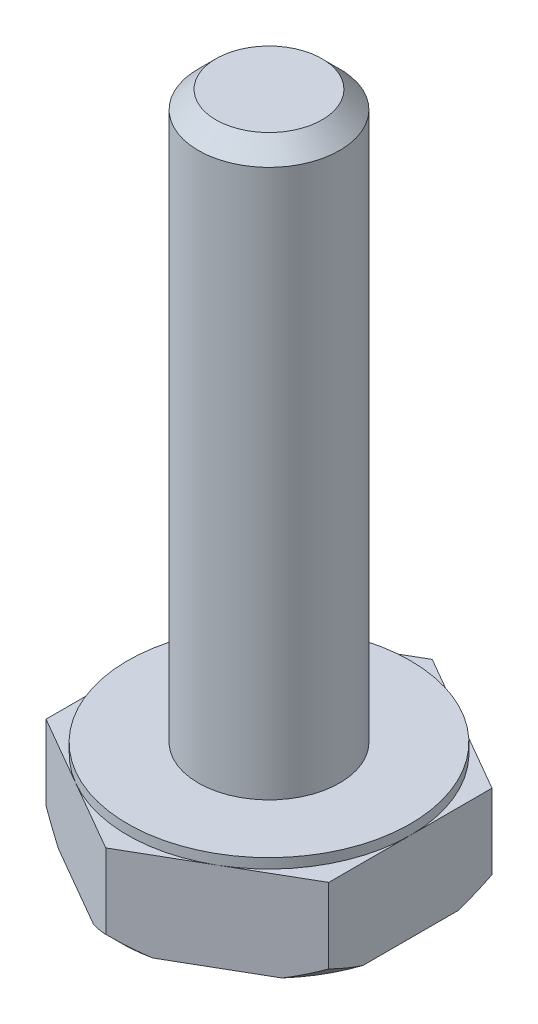
ISO-10303-21;
HEADER;
FILE_DESCRIPTION(('STEP AP214'),'2;1');
FILE_NAME('part.step','',(''),(''),'','','');
FILE_SCHEMA(('AUTOMOTIVE_DESIGN { 1 0 10303 214 1 1 1 1 }'));
ENDSEC;
DATA;
#1=APPLICATION_CONTEXT('core data for automotive mechanical design processes');
#2=APPLICATION_PROTOCOL_DEFINITION('international standard','automotive_design',2000,#1);
#3=PRODUCT_CONTEXT('',#1,'mechanical');
#4=PRODUCT('Part','Part','',(#3));
#5=PRODUCT_RELATED_PRODUCT_CATEGORY('part','',(#4));
#6=PRODUCT_DEFINITION_FORMATION('','',#4);
#7=PRODUCT_DEFINITION_CONTEXT('part definition',#1,'design');
#8=PRODUCT_DEFINITION('design','',#6,#7);
#9=PRODUCT_DEFINITION_SHAPE('','',#8);
#10=(LENGTH_UNIT() NAMED_UNIT(*) SI_UNIT(.MILLI.,.METRE.));
#11=(NAMED_UNIT(*) PLANE_ANGLE_UNIT() SI_UNIT($,.RADIAN.));
#12=(NAMED_UNIT(*) SI_UNIT($,.STERADIAN.) SOLID_ANGLE_UNIT());
#13=UNCERTAINTY_MEASURE_WITH_UNIT(LENGTH_MEASURE(1.E-05),#10,'distance_accuracy_value','');
#14=(GEOMETRIC_REPRESENTATION_CONTEXT(3) GLOBAL_UNCERTAINTY_ASSIGNED_CONTEXT((#13)) GLOBAL_UNIT_ASSIGNED_CONTEXT((#10,
#11,#12)) REPRESENTATION_CONTEXT('',''));
#15=CARTESIAN_POINT('',(0.,0.,0.));
#16=DIRECTION('',(0.,0.,1.));
#17=DIRECTION('',(1.,0.,0.));
#18=AXIS2_PLACEMENT_3D('',#15,#16,#17);
#19=CARTESIAN_POINT('',(2.,-1.4,1.15470053837925));
#20=DIRECTION('',(-0.5,0.,-0.866025403784439));
#21=DIRECTION('',(-0.866025403784439,0.,0.5));
#22=AXIS2_PLACEMENT_3D('',#19,#20,#21);
#23=PLANE('',#22);
#24=CARTESIAN_POINT('',(3.3910270920571,-0.100195782274932,0.351590672330025));
#25=CARTESIAN_POINT('',(3.34354492104427,-0.144594369777861,0.379004516545986));
#26=CARTESIAN_POINT('',(3.29587314771856,-0.188722194214535,0.406527827708332));
#27=CARTESIAN_POINT('',(3.20008478309438,-0.276339275319588,0.461831265809335));
#28=CARTESIAN_POINT('',(3.15196815217326,-0.31982847419622,0.489611415624142));
#29=CARTESIAN_POINT('',(3.00663470734059,-0.449386265959303,0.573519719120544));
#30=CARTESIAN_POINT('',(2.90866023209742,-0.534332308383371,0.6300853087759));
#31=CARTESIAN_POINT('',(2.70727689839547,-0.702313701082601,0.746354030699024));
#32=CARTESIAN_POINT('',(2.60379268655646,-0.785229331210698,0.80610066826115));
#33=CARTESIAN_POINT('',(2.39312491527532,-0.944399581791169,0.927729762719897));
#34=CARTESIAN_POINT('',(2.28594528845487,-1.0206609958631,0.989609949116325));
#35=CARTESIAN_POINT('',(2.12041002695036,-1.12802642435662,1.08518177690633));
#36=CARTESIAN_POINT('',(2.06391337670326,-1.16292144649884,1.1178001331348));
#37=CARTESIAN_POINT('',(1.94946166154732,-1.22933713888442,1.1838788616893));
#38=CARTESIAN_POINT('',(1.89150639158025,-1.26085733137186,1.21733935240575));
#39=CARTESIAN_POINT('',(1.71580642824051,-1.34875156017951,1.31877977353656));
#40=CARTESIAN_POINT('',(1.59552388469169,-1.39893934247507,1.38822493243328));
#41=CARTESIAN_POINT('',(1.42261342322878,-1.45147464181688,1.48805483390459));
#42=CARTESIAN_POINT('',(1.37238177229886,-1.464508697261,1.51705609109082));
#43=CARTESIAN_POINT('',(1.27118130087747,-1.48585011351804,1.57548421050808));
#44=CARTESIAN_POINT('',(1.22021288943875,-1.49416000110673,1.60491083657239));
#45=CARTESIAN_POINT('',(1.11791583738946,-1.50563215368217,1.66397206711035));
#46=CARTESIAN_POINT('',(1.06658785263823,-1.5088021297567,1.69360629292343));
#47=CARTESIAN_POINT('',(0.96388966784885,-1.50984521354556,1.75289911755687));
#48=CARTESIAN_POINT('',(0.912519467250178,-1.50771824975614,1.78255771670084));
#49=CARTESIAN_POINT('',(0.810289296839596,-1.49829850913321,1.84158033310669));
#50=CARTESIAN_POINT('',(0.759428287920763,-1.49102052474989,1.87094495029723));
#51=CARTESIAN_POINT('',(0.658389988435767,-1.47168571303428,1.92927943970336));
#52=CARTESIAN_POINT('',(0.608212859359108,-1.45962777652917,1.95824921868293));
#53=CARTESIAN_POINT('',(0.50863160466104,-1.43122675618574,2.0157424828891));
#54=CARTESIAN_POINT('',(0.459230174418972,-1.41487122151319,2.04426441193771));
#55=CARTESIAN_POINT('',(0.361466257287717,-1.37849100925759,2.10070843581047));
#56=CARTESIAN_POINT('',(0.313103718239691,-1.35846651636251,2.12863056074854));
#57=CARTESIAN_POINT('',(0.199799105244888,-1.30737607555432,2.19404700956152));
#58=CARTESIAN_POINT('',(0.135315115130632,-1.27496059736795,2.23127685861241));
#59=CARTESIAN_POINT('',(0.00818006045399488,-1.20561721016145,2.3046783166534));
#60=CARTESIAN_POINT('',(-0.0544699994200348,-1.16868688304807,2.34084934558642));
#61=CARTESIAN_POINT('',(-0.178251246858647,-1.09125768375401,2.41231448211573));
#62=CARTESIAN_POINT('',(-0.239378976613405,-1.05075149602712,2.44760659334459));
#63=CARTESIAN_POINT('',(-0.360192679905363,-0.967014392289174,2.517358417462));
#64=CARTESIAN_POINT('',(-0.419878908751582,-0.923783963746002,2.55181827775328));
#65=CARTESIAN_POINT('',(-0.597659224843745,-0.790500603698508,2.6544597911057));
#66=CARTESIAN_POINT('',(-0.713928810209164,-0.697211033882321,2.72158806751499));
#67=CARTESIAN_POINT('',(-0.942866367163964,-0.505274888207762,2.85376522765046));
#68=CARTESIAN_POINT('',(-1.05553780865463,-0.40663373724072,2.91881611472508));
#69=CARTESIAN_POINT('',(-1.20463750696756,-0.272142780819644,3.00489886568214));
#70=CARTESIAN_POINT('',(-1.24218375119835,-0.237933000868121,3.02657619989585));
#71=CARTESIAN_POINT('',(-1.31686720192227,-0.169268680695386,3.06969471027532));
#72=CARTESIAN_POINT('',(-1.35400543619641,-0.134815631473534,3.09113647983072));
#73=CARTESIAN_POINT('',(-1.3910270920571,-0.100195782274933,3.11251094280773));
#74=B_SPLINE_CURVE_WITH_KNOTS('',3,(#24,#25,#26,#27,#28,#29,#30,#31,#32,#33,#34,#35,#36,#37,#38,
#39,#40,#41,#42,#43,#44,#45,#46,#47,#48,#49,#50,#51,#52,#53,#54,#55,#56,#57,#58,#59,#60,#61,#62,
#63,#64,#65,#66,#67,#68,#69,#70,#71,#72,#73),.UNSPECIFIED.,.F.,.F.,(4,2,2,2,2,2,2,2,2,2,2,2,2,2,
2,2,2,2,2,2,2,2,2,2,4),(0.,0.211648022391108,0.423315081060597,0.847658721996938,
1.28385997898958,1.71961055439068,1.94146481208378,2.16335043504383,2.60430249046376,
2.78249290019255,2.96058791283644,3.13841549262573,3.31624547293468,3.49356683109208,
3.67092936021967,3.84881151394884,4.02668471590855,4.27010777970963,4.51366179358974,
4.75772616245818,5.00174698247488,5.49195576057539,5.98167657652388,6.14735391628999,
6.31237991032623),.UNSPECIFIED.);
#75=CARTESIAN_POINT('',(2.,-1.2,1.15470053837925));
#76=VERTEX_POINT('',#75);
#77=CARTESIAN_POINT('',(1.58067174631839,-1.4,1.39679981852114));
#78=VERTEX_POINT('',#77);
#79=EDGE_CURVE('E164',#76,#78,#74,.T.);
#80=ORIENTED_EDGE('',*,*,#79,.F.);
#81=DIRECTION('',(0.,1.,0.));
#82=VECTOR('',#81,1.);
#83=CARTESIAN_POINT('',(2.,-1.4,1.15470053837925));
#84=LINE('',#83,#82);
#85=CARTESIAN_POINT('',(2.,-0.14,1.15470053837925));
#86=VERTEX_POINT('',#85);
#87=EDGE_CURVE('E196',#76,#86,#84,.T.);
#88=ORIENTED_EDGE('',*,*,#87,.T.);
#89=DIRECTION('',(-0.866025403784439,0.,0.5));
#90=VECTOR('',#89,1.);
#91=CARTESIAN_POINT('',(2.,-0.14,1.15470053837925));
#92=LINE('',#91,#90);
#93=CARTESIAN_POINT('',(1.,-0.14,1.73205080756888));
#94=VERTEX_POINT('',#93);
#95=EDGE_CURVE('E197',#86,#94,#92,.T.);
#96=ORIENTED_EDGE('',*,*,#95,.T.);
#97=CARTESIAN_POINT('',(0.,-0.14,2.3094010767585));
#98=VERTEX_POINT('',#97);
#99=EDGE_CURVE('E162',#94,#98,#92,.T.);
#100=ORIENTED_EDGE('',*,*,#99,.T.);
#101=DIRECTION('',(0.,1.,0.));
#102=VECTOR('',#101,1.);
#103=CARTESIAN_POINT('',(0.,-1.4,2.3094010767585));
#104=LINE('',#103,#102);
#105=CARTESIAN_POINT('',(0.,-1.2,2.3094010767585));
#106=VERTEX_POINT('',#105);
#107=EDGE_CURVE('E161',#106,#98,#104,.T.);
#108=ORIENTED_EDGE('',*,*,#107,.F.);
#109=CARTESIAN_POINT('',(0.419328253681606,-1.4,2.06730179661661));
#110=VERTEX_POINT('',#109);
#111=EDGE_CURVE('E145',#110,#106,#74,.T.);
#112=ORIENTED_EDGE('',*,*,#111,.F.);
#113=DIRECTION('',(-0.866025403784439,0.,0.5));
#114=VECTOR('',#113,1.);
#115=CARTESIAN_POINT('',(2.,-1.4,1.15470053837925));
#116=LINE('',#115,#114);
#117=EDGE_CURVE('E159',#78,#110,#116,.T.);
#118=ORIENTED_EDGE('',*,*,#117,.F.);
#119=EDGE_LOOP('',(#80,#88,#96,#100,#108,#112,#118));
#120=FACE_BOUND('',#119,.T.);
#121=ADVANCED_FACE('F36',(#120),#23,.F.);
#122=CARTESIAN_POINT('',(0.,-1.4,2.3094010767585));
#123=DIRECTION('',(0.499999999999999,0.,-0.866025403784439));
#124=DIRECTION('',(-0.866025403784439,0.,-0.5));
#125=AXIS2_PLACEMENT_3D('',#122,#123,#124);
#126=PLANE('',#125);
#127=CARTESIAN_POINT('',(1.3910270920571,-0.100195782274932,3.11251094280773));
#128=CARTESIAN_POINT('',(1.34354492104428,-0.144594369777861,3.08509709859177));
#129=CARTESIAN_POINT('',(1.29587314771856,-0.188722194214535,3.05757378742942));
#130=CARTESIAN_POINT('',(1.20008478309439,-0.276339275319587,3.00227034932842));
#131=CARTESIAN_POINT('',(1.15196815217327,-0.31982847419622,2.97449019951361));
#132=CARTESIAN_POINT('',(1.00663470734059,-0.449386265959303,2.89058189601721));
#133=CARTESIAN_POINT('',(0.908660232097419,-0.534332308383371,2.83401630636185));
#134=CARTESIAN_POINT('',(0.707276898395472,-0.702313701082601,2.71774758443873));
#135=CARTESIAN_POINT('',(0.603792686556467,-0.785229331210697,2.65800094687661));
#136=CARTESIAN_POINT('',(0.393124915275324,-0.944399581791167,2.53637185241786));
#137=CARTESIAN_POINT('',(0.285945288454877,-1.0206609958631,2.47449166602143));
#138=CARTESIAN_POINT('',(0.120410026950362,-1.12802642435661,2.37891983823142));
#139=CARTESIAN_POINT('',(0.0639133767032671,-1.16292144649884,2.34630148200295));
#140=CARTESIAN_POINT('',(-0.0505383384526776,-1.22933713888442,2.28022275344845));
#141=CARTESIAN_POINT('',(-0.108493608419747,-1.26085733137186,2.24676226273201));
#142=CARTESIAN_POINT('',(-0.284193571759491,-1.34875156017951,2.1453218416012));
#143=CARTESIAN_POINT('',(-0.404476115308308,-1.39893934247507,2.07587668270448));
#144=CARTESIAN_POINT('',(-0.577386576771219,-1.45147464181688,1.97604678123316));
#145=CARTESIAN_POINT('',(-0.62761822770114,-1.464508697261,1.94704552404693));
#146=CARTESIAN_POINT('',(-0.728818699122525,-1.48585011351804,1.88861740462968));
#147=CARTESIAN_POINT('',(-0.779787110561246,-1.49416000110673,1.85919077856537));
#148=CARTESIAN_POINT('',(-0.882084162610538,-1.50563215368217,1.8001295480274));
#149=CARTESIAN_POINT('',(-0.933412147361764,-1.5088021297567,1.77049532221432));
#150=CARTESIAN_POINT('',(-1.03611033215115,-1.50984521354556,1.71120249758089));
#151=CARTESIAN_POINT('',(-1.08748053274982,-1.50771824975614,1.68154389843692));
#152=CARTESIAN_POINT('',(-1.1897107031604,-1.49829850913321,1.62252128203107));
#153=CARTESIAN_POINT('',(-1.24057171207923,-1.49102052474989,1.59315666484052));
#154=CARTESIAN_POINT('',(-1.34161001156423,-1.47168571303428,1.5348221754344));
#155=CARTESIAN_POINT('',(-1.39178714064089,-1.45962777652917,1.50585239645483));
#156=CARTESIAN_POINT('',(-1.49136839533896,-1.43122675618574,1.44835913224866));
#157=CARTESIAN_POINT('',(-1.54076982558103,-1.41487122151319,1.41983720320005));
#158=CARTESIAN_POINT('',(-1.63853374271228,-1.3784910092576,1.36339317932728));
#159=CARTESIAN_POINT('',(-1.68689628176031,-1.35846651636251,1.33547105438921));
#160=CARTESIAN_POINT('',(-1.80020089475511,-1.30737607555433,1.27005460557624));
#161=CARTESIAN_POINT('',(-1.86468488486936,-1.27496059736795,1.23282475652535));
#162=CARTESIAN_POINT('',(-1.991819939546,-1.20561721016146,1.15942329848436));
#163=CARTESIAN_POINT('',(-2.05446999942003,-1.16868688304807,1.12325226955134));
#164=CARTESIAN_POINT('',(-2.17825124685864,-1.09125768375401,1.05178713302203));
#165=CARTESIAN_POINT('',(-2.2393789766134,-1.05075149602712,1.01649502179317));
#166=CARTESIAN_POINT('',(-2.36019267990536,-0.967014392289178,0.946743197675762));
#167=CARTESIAN_POINT('',(-2.41987890875158,-0.923783963746006,0.912283337384484));
#168=CARTESIAN_POINT('',(-2.59765922484374,-0.790500603698513,0.809641824032057));
#169=CARTESIAN_POINT('',(-2.71392881020916,-0.697211033882326,0.742513547622766));
#170=CARTESIAN_POINT('',(-2.94286636716396,-0.505274888207768,0.610336387487298));
#171=CARTESIAN_POINT('',(-3.05553780865462,-0.406633737240726,0.545285500412679));
#172=CARTESIAN_POINT('',(-3.20463750696755,-0.27214278081965,0.459202749455619));
#173=CARTESIAN_POINT('',(-3.24218375119834,-0.237933000868126,0.437525415241911));
#174=CARTESIAN_POINT('',(-3.31686720192227,-0.169268680695388,0.394406904862439));
#175=CARTESIAN_POINT('',(-3.35400543619641,-0.134815631473534,0.372965135307037));
#176=CARTESIAN_POINT('',(-3.3910270920571,-0.100195782274931,0.351590672330025));
#177=B_SPLINE_CURVE_WITH_KNOTS('',3,(#127,#128,#129,#130,#131,#132,#133,#134,#135,#136,#137,
#138,#139,#140,#141,#142,#143,#144,#145,#146,#147,#148,#149,#150,#151,#152,#153,#154,#155,#156,
#157,#158,#159,#160,#161,#162,#163,#164,#165,#166,#167,#168,#169,#170,#171,#172,#173,#174,#175,
#176),.UNSPECIFIED.,.F.,.F.,(4,2,2,2,2,2,2,2,2,2,2,2,2,2,2,2,2,2,2,2,2,2,2,2,4),(0.,
0.211648022391107,0.423315081060596,0.847658721996936,1.28385997898958,1.71961055439067,
1.94146481208377,2.16335043504383,2.60430249046375,2.78249290019255,2.96058791283644,
3.13841549262573,3.31624547293468,3.49356683109207,3.67092936021967,3.84881151394884,
4.02668471590855,4.27010777970963,4.51366179358973,4.75772616245818,5.00174698247488,
5.49195576057538,5.98167657652387,6.14735391628999,6.31237991032624),.UNSPECIFIED.);
#178=CARTESIAN_POINT('',(-0.419328253681603,-1.4,2.06730179661661));
#179=VERTEX_POINT('',#178);
#180=EDGE_CURVE('E147',#106,#179,#177,.T.);
#181=ORIENTED_EDGE('',*,*,#180,.F.);
#182=ORIENTED_EDGE('',*,*,#107,.T.);
#183=DIRECTION('',(-0.866025403784439,0.,-0.499999999999999));
#184=VECTOR('',#183,1.);
#185=CARTESIAN_POINT('',(0.,-0.14,2.3094010767585));
#186=LINE('',#185,#184);
#187=CARTESIAN_POINT('',(-0.999999999999999,-0.14,1.73205080756888));
#188=VERTEX_POINT('',#187);
#189=EDGE_CURVE('E201',#98,#188,#186,.T.);
#190=ORIENTED_EDGE('',*,*,#189,.T.);
#191=CARTESIAN_POINT('',(-2.,-0.14,1.15470053837925));
#192=VERTEX_POINT('',#191);
#193=EDGE_CURVE('E200',#188,#192,#186,.T.);
#194=ORIENTED_EDGE('',*,*,#193,.T.);
#195=DIRECTION('',(0.,1.,0.));
#196=VECTOR('',#195,1.);
#197=CARTESIAN_POINT('',(-2.,-1.4,1.15470053837925));
#198=LINE('',#197,#196);
#199=CARTESIAN_POINT('',(-2.,-1.2,1.15470053837925));
#200=VERTEX_POINT('',#199);
#201=EDGE_CURVE('E223',#200,#192,#198,.T.);
#202=ORIENTED_EDGE('',*,*,#201,.F.);
#203=CARTESIAN_POINT('',(-1.58067174631839,-1.4,1.39679981852114));
#204=VERTEX_POINT('',#203);
#205=EDGE_CURVE('E178',#204,#200,#177,.T.);
#206=ORIENTED_EDGE('',*,*,#205,.F.);
#207=DIRECTION('',(-0.866025403784439,0.,-0.499999999999999));
#208=VECTOR('',#207,1.);
#209=CARTESIAN_POINT('',(0.,-1.4,2.3094010767585));
#210=LINE('',#209,#208);
#211=EDGE_CURVE('E169',#179,#204,#210,.T.);
#212=ORIENTED_EDGE('',*,*,#211,.F.);
#213=EDGE_LOOP('',(#181,#182,#190,#194,#202,#206,#212));
#214=FACE_BOUND('',#213,.T.);
#215=ADVANCED_FACE('F303',(#214),#126,.F.);
#216=CARTESIAN_POINT('',(-2.,-1.4,1.15470053837925));
#217=DIRECTION('',(1.,0.,0.));
#218=DIRECTION('',(0.,0.,-1.));
#219=AXIS2_PLACEMENT_3D('',#216,#217,#218);
#220=PLANE('',#219);
#221=CARTESIAN_POINT('',(-2.,-0.272005647039239,2.54572763043635));
#222=CARTESIAN_POINT('',(-2.,-0.316975037574743,2.48852994499579));
#223=CARTESIAN_POINT('',(-2.,-0.361598260022792,2.4310565421804));
#224=CARTESIAN_POINT('',(-2.,-0.450003271813665,2.31545160217196));
#225=CARTESIAN_POINT('',(-2.,-0.493784919916561,2.25731995706426));
#226=CARTESIAN_POINT('',(-2.,-0.580564562415125,2.14001077548503));
#227=CARTESIAN_POINT('',(-2.,-0.62355738661351,2.08082940421716));
#228=CARTESIAN_POINT('',(-2.,-0.708313034538815,1.96159468645173));
#229=CARTESIAN_POINT('',(-2.,-0.750075917767917,1.90154138234716));
#230=CARTESIAN_POINT('',(-2.,-0.834155232348446,1.77739420471745));
#231=CARTESIAN_POINT('',(-2.,-0.87639515559175,1.71324831588814));
#232=CARTESIAN_POINT('',(-2.,-0.958822018340042,1.58365223475809));
#233=CARTESIAN_POINT('',(-2.,-0.999009131326467,1.51820215332567));
#234=CARTESIAN_POINT('',(-2.,-1.0767323603198,1.38590678310664));
#235=CARTESIAN_POINT('',(-2.,-1.11427342206818,1.31906441701374));
#236=CARTESIAN_POINT('',(-2.,-1.1860947484259,1.18365795126856));
#237=CARTESIAN_POINT('',(-2.,-1.22037591322758,1.11509433357404));
#238=CARTESIAN_POINT('',(-2.,-1.28143247059953,0.983303797242553));
#239=CARTESIAN_POINT('',(-2.,-1.30861786964741,0.920268247578223));
#240=CARTESIAN_POINT('',(-2.,-1.35888901505767,0.79255705555972));
#241=CARTESIAN_POINT('',(-2.,-1.3819743666918,0.727881255976266));
#242=CARTESIAN_POINT('',(-2.,-1.42290625101822,0.597688548618581));
#243=CARTESIAN_POINT('',(-2.,-1.44081000077024,0.532189878677661));
#244=CARTESIAN_POINT('',(-2.,-1.47083203570401,0.399885349952513));
#245=CARTESIAN_POINT('',(-2.,-1.48295263248925,0.333080024590104));
#246=CARTESIAN_POINT('',(-2.,-1.50083417338571,0.197344496728344));
#247=CARTESIAN_POINT('',(-2.,-1.50647308291583,0.128397860061204));
#248=CARTESIAN_POINT('',(-2.,-1.51056851351583,-0.00970684740618085));
#249=CARTESIAN_POINT('',(-2.,-1.50902562079984,-0.0788649004890811));
#250=CARTESIAN_POINT('',(-2.,-1.49885915750695,-0.216868519098935));
#251=CARTESIAN_POINT('',(-2.,-1.49021319141547,-0.285712402764717));
#252=CARTESIAN_POINT('',(-2.,-1.46641894880563,-0.422260210478995));
#253=CARTESIAN_POINT('',(-2.,-1.45126893479239,-0.489963824889282));
#254=CARTESIAN_POINT('',(-2.,-1.40965675858909,-0.645094306010171));
#255=CARTESIAN_POINT('',(-2.,-1.38113054870437,-0.731963067258214));
#256=CARTESIAN_POINT('',(-2.,-1.31650163338185,-0.902818246460519));
#257=CARTESIAN_POINT('',(-2.,-1.28039430480769,-0.986802869071232));
#258=CARTESIAN_POINT('',(-2.,-1.20219846539526,-1.1526353367736));
#259=CARTESIAN_POINT('',(-2.,-1.16006913864542,-1.23446367366693));
#260=CARTESIAN_POINT('',(-2.,-1.07148730645871,-1.39569249562416));
#261=CARTESIAN_POINT('',(-2.,-1.02503583237866,-1.47509355391136));
#262=CARTESIAN_POINT('',(-2.,-0.923301843612273,-1.64093947364516));
#263=CARTESIAN_POINT('',(-2.,-0.867619257183801,-1.72713724476575));
#264=CARTESIAN_POINT('',(-2.,-0.753218152094097,-1.8975038941697));
#265=CARTESIAN_POINT('',(-2.,-0.69449902479636,-1.9816723607086));
#266=CARTESIAN_POINT('',(-2.,-0.576061411354393,-2.1465577639636));
#267=CARTESIAN_POINT('',(-2.,-0.516391783710413,-2.22730999043807));
#268=CARTESIAN_POINT('',(-2.,-0.395360845348134,-2.38745478871758));
#269=CARTESIAN_POINT('',(-2.,-0.334000684100647,-2.46684822764876));
#270=CARTESIAN_POINT('',(-2.,-0.272005647039238,-2.54572763043635));
#271=B_SPLINE_CURVE_WITH_KNOTS('',3,(#221,#222,#223,#224,#225,#226,#227,#228,#229,#230,#231,
#232,#233,#234,#235,#236,#237,#238,#239,#240,#241,#242,#243,#244,#245,#246,#247,#248,#249,#250,
#251,#252,#253,#254,#255,#256,#257,#258,#259,#260,#261,#262,#263,#264,#265,#266,#267,#268,#269,
#270),.UNSPECIFIED.,.F.,.F.,(4,2,2,2,2,2,2,2,2,2,2,2,2,2,2,2,2,2,2,2,2,2,2,2,4),(0.,
0.218278765729078,0.436593850467245,0.656028511994943,0.875452540198025,1.10583433265688,
1.33619662340527,1.56611625196332,1.7959722047045,2.00179997803448,2.20764755651286,
2.41112685243713,2.61452474669124,2.8216924546329,3.02884325282048,3.23664970158397,
3.44451169845146,3.71832778451014,3.99231133728719,4.26824867682538,4.54412033985116,
4.85188981387714,5.15972121735645,5.46091423295189,5.76190727591802),.UNSPECIFIED.);
#272=CARTESIAN_POINT('',(-2.,-1.4,0.67050197809547));
#273=VERTEX_POINT('',#272);
#274=EDGE_CURVE('E297',#200,#273,#271,.T.);
#275=ORIENTED_EDGE('',*,*,#274,.F.);
#276=ORIENTED_EDGE('',*,*,#201,.T.);
#277=DIRECTION('',(0.,0.,-1.));
#278=VECTOR('',#277,1.);
#279=CARTESIAN_POINT('',(-2.,-0.14,1.15470053837925));
#280=LINE('',#279,#278);
#281=CARTESIAN_POINT('',(-2.,-0.14,0.));
#282=VERTEX_POINT('',#281);
#283=EDGE_CURVE('E205',#192,#282,#280,.T.);
#284=ORIENTED_EDGE('',*,*,#283,.T.);
#285=CARTESIAN_POINT('',(-2.,-0.14,-1.15470053837925));
#286=VERTEX_POINT('',#285);
#287=EDGE_CURVE('E204',#282,#286,#280,.T.);
#288=ORIENTED_EDGE('',*,*,#287,.T.);
#289=DIRECTION('',(0.,1.,0.));
#290=VECTOR('',#289,1.);
#291=CARTESIAN_POINT('',(-2.,-1.4,-1.15470053837925));
#292=LINE('',#291,#290);
#293=CARTESIAN_POINT('',(-2.,-1.2,-1.15470053837925));
#294=VERTEX_POINT('',#293);
#295=EDGE_CURVE('E221',#294,#286,#292,.T.);
#296=ORIENTED_EDGE('',*,*,#295,.F.);
#297=CARTESIAN_POINT('',(-2.,-1.4,-0.67050197809547));
#298=VERTEX_POINT('',#297);
#299=EDGE_CURVE('E291',#298,#294,#271,.T.);
#300=ORIENTED_EDGE('',*,*,#299,.F.);
#301=DIRECTION('',(0.,0.,-1.));
#302=VECTOR('',#301,1.);
#303=CARTESIAN_POINT('',(-2.,-1.4,1.15470053837925));
#304=LINE('',#303,#302);
#305=EDGE_CURVE('E172',#273,#298,#304,.T.);
#306=ORIENTED_EDGE('',*,*,#305,.F.);
#307=EDGE_LOOP('',(#275,#276,#284,#288,#296,#300,#306));
#308=FACE_BOUND('',#307,.T.);
#309=ADVANCED_FACE('F299',(#308),#220,.F.);
#310=CARTESIAN_POINT('',(-2.,-1.4,-1.15470053837925));
#311=DIRECTION('',(0.5,0.,0.866025403784439));
#312=DIRECTION('',(0.866025403784439,0.,-0.5));
#313=AXIS2_PLACEMENT_3D('',#310,#311,#312);
#314=PLANE('',#313);
#315=CARTESIAN_POINT('',(-3.3910270920571,-0.100195782274932,-0.351590672330026));
#316=CARTESIAN_POINT('',(-3.34354492104427,-0.144594369777861,-0.379004516545987));
#317=CARTESIAN_POINT('',(-3.29587314771856,-0.188722194214535,-0.406527827708333));
#318=CARTESIAN_POINT('',(-3.20008478309438,-0.276339275319587,-0.461831265809337));
#319=CARTESIAN_POINT('',(-3.15196815217326,-0.319828474196219,-0.489611415624143));
#320=CARTESIAN_POINT('',(-3.00663470734059,-0.449386265959303,-0.573519719120545));
#321=CARTESIAN_POINT('',(-2.90866023209742,-0.534332308383371,-0.630085308775902));
#322=CARTESIAN_POINT('',(-2.70727689839547,-0.702313701082602,-0.746354030699026));
#323=CARTESIAN_POINT('',(-2.60379268655646,-0.785229331210698,-0.806100668261152));
#324=CARTESIAN_POINT('',(-2.39312491527532,-0.94439958179117,-0.927729762719899));
#325=CARTESIAN_POINT('',(-2.28594528845487,-1.0206609958631,-0.989609949116328));
#326=CARTESIAN_POINT('',(-2.12041002695036,-1.12802642435662,-1.08518177690633));
#327=CARTESIAN_POINT('',(-2.06391337670326,-1.16292144649884,-1.11780013313481));
#328=CARTESIAN_POINT('',(-1.94946166154732,-1.22933713888442,-1.18387886168931));
#329=CARTESIAN_POINT('',(-1.89150639158025,-1.26085733137186,-1.21733935240575));
#330=CARTESIAN_POINT('',(-1.7158064282405,-1.34875156017951,-1.31877977353656));
#331=CARTESIAN_POINT('',(-1.59552388469169,-1.39893934247507,-1.38822493243328));
#332=CARTESIAN_POINT('',(-1.42261342322878,-1.45147464181688,-1.4880548339046));
#333=CARTESIAN_POINT('',(-1.37238177229886,-1.464508697261,-1.51705609109082));
#334=CARTESIAN_POINT('',(-1.27118130087747,-1.48585011351804,-1.57548421050808));
#335=CARTESIAN_POINT('',(-1.22021288943875,-1.49416000110673,-1.60491083657239));
#336=CARTESIAN_POINT('',(-1.11791583738946,-1.50563215368216,-1.66397206711036));
#337=CARTESIAN_POINT('',(-1.06658785263823,-1.5088021297567,-1.69360629292344));
#338=CARTESIAN_POINT('',(-0.963889667848849,-1.50984521354556,-1.75289911755687));
#339=CARTESIAN_POINT('',(-0.912519467250176,-1.50771824975614,-1.78255771670084));
#340=CARTESIAN_POINT('',(-0.810289296839595,-1.49829850913321,-1.84158033310669));
#341=CARTESIAN_POINT('',(-0.759428287920762,-1.49102052474989,-1.87094495029724));
#342=CARTESIAN_POINT('',(-0.658389988435767,-1.47168571303427,-1.92927943970336));
#343=CARTESIAN_POINT('',(-0.608212859359107,-1.45962777652917,-1.95824921868293));
#344=CARTESIAN_POINT('',(-0.508631604661039,-1.43122675618574,-2.0157424828891));
#345=CARTESIAN_POINT('',(-0.459230174418971,-1.41487122151318,-2.04426441193771));
#346=CARTESIAN_POINT('',(-0.361466257287716,-1.37849100925759,-2.10070843581047));
#347=CARTESIAN_POINT('',(-0.31310371823969,-1.3584665163625,-2.12863056074855));
#348=CARTESIAN_POINT('',(-0.199799105244886,-1.30737607555432,-2.19404700956152));
#349=CARTESIAN_POINT('',(-0.135315115130631,-1.27496059736795,-2.23127685861241));
#350=CARTESIAN_POINT('',(-0.00818006045399356,-1.20561721016145,-2.3046783166534));
#351=CARTESIAN_POINT('',(0.0544699994200362,-1.16868688304807,-2.34084934558642));
#352=CARTESIAN_POINT('',(0.178251246858648,-1.09125768375401,-2.41231448211573));
#353=CARTESIAN_POINT('',(0.239378976613407,-1.05075149602712,-2.44760659334459));
#354=CARTESIAN_POINT('',(0.360192679905365,-0.967014392289171,-2.517358417462));
#355=CARTESIAN_POINT('',(0.419878908751585,-0.923783963745999,-2.55181827775328));
#356=CARTESIAN_POINT('',(0.597659224843749,-0.790500603698505,-2.65445979110571));
#357=CARTESIAN_POINT('',(0.713928810209168,-0.697211033882317,-2.721588067515));
#358=CARTESIAN_POINT('',(0.942866367163968,-0.505274888207757,-2.85376522765047));
#359=CARTESIAN_POINT('',(1.05553780865463,-0.406633737240715,-2.91881611472509));
#360=CARTESIAN_POINT('',(1.20463750696756,-0.27214278081964,-3.00489886568214));
#361=CARTESIAN_POINT('',(1.24218375119835,-0.237933000868118,-3.02657619989585));
#362=CARTESIAN_POINT('',(1.31686720192228,-0.169268680695384,-3.06969471027532));
#363=CARTESIAN_POINT('',(1.35400543619641,-0.134815631473532,-3.09113647983072));
#364=CARTESIAN_POINT('',(1.3910270920571,-0.100195782274931,-3.11251094280773));
#365=B_SPLINE_CURVE_WITH_KNOTS('',3,(#315,#316,#317,#318,#319,#320,#321,#322,#323,#324,#325,
#326,#327,#328,#329,#330,#331,#332,#333,#334,#335,#336,#337,#338,#339,#340,#341,#342,#343,#344,
#345,#346,#347,#348,#349,#350,#351,#352,#353,#354,#355,#356,#357,#358,#359,#360,#361,#362,#363,
#364),.UNSPECIFIED.,.F.,.F.,(4,2,2,2,2,2,2,2,2,2,2,2,2,2,2,2,2,2,2,2,2,2,2,2,4),(0.,
0.211648022391108,0.423315081060598,0.847658721996939,1.28385997898958,1.71961055439068,
1.94146481208378,2.16335043504383,2.60430249046376,2.78249290019255,2.96058791283644,
3.13841549262574,3.31624547293468,3.49356683109208,3.67092936021967,3.84881151394884,
4.02668471590855,4.27010777970963,4.51366179358974,4.75772616245819,5.00174698247489,
5.49195576057539,5.98167657652388,6.14735391629,6.31237991032623),.UNSPECIFIED.);
#366=CARTESIAN_POINT('',(-1.58067174631839,-1.4,-1.39679981852115));
#367=VERTEX_POINT('',#366);
#368=EDGE_CURVE('E298',#294,#367,#365,.T.);
#369=ORIENTED_EDGE('',*,*,#368,.F.);
#370=ORIENTED_EDGE('',*,*,#295,.T.);
#371=DIRECTION('',(0.866025403784439,0.,-0.5));
#372=VECTOR('',#371,1.);
#373=CARTESIAN_POINT('',(-2.,-0.14,-1.15470053837925));
#374=LINE('',#373,#372);
#375=CARTESIAN_POINT('',(-1.,-0.14,-1.73205080756888));
#376=VERTEX_POINT('',#375);
#377=EDGE_CURVE('E209',#286,#376,#374,.T.);
#378=ORIENTED_EDGE('',*,*,#377,.T.);
#379=CARTESIAN_POINT('',(0.,-0.14,-2.3094010767585));
#380=VERTEX_POINT('',#379);
#381=EDGE_CURVE('E208',#376,#380,#374,.T.);
#382=ORIENTED_EDGE('',*,*,#381,.T.);
#383=DIRECTION('',(0.,1.,0.));
#384=VECTOR('',#383,1.);
#385=CARTESIAN_POINT('',(0.,-1.4,-2.3094010767585));
#386=LINE('',#385,#384);
#387=CARTESIAN_POINT('',(0.,-1.2,-2.3094010767585));
#388=VERTEX_POINT('',#387);
#389=EDGE_CURVE('E219',#388,#380,#386,.T.);
#390=ORIENTED_EDGE('',*,*,#389,.F.);
#391=CARTESIAN_POINT('',(-0.41932825368161,-1.4,-2.06730179661661));
#392=VERTEX_POINT('',#391);
#393=EDGE_CURVE('E261',#392,#388,#365,.T.);
#394=ORIENTED_EDGE('',*,*,#393,.F.);
#395=DIRECTION('',(0.866025403784439,0.,-0.5));
#396=VECTOR('',#395,1.);
#397=CARTESIAN_POINT('',(-2.,-1.4,-1.15470053837925));
#398=LINE('',#397,#396);
#399=EDGE_CURVE('E189',#367,#392,#398,.T.);
#400=ORIENTED_EDGE('',*,*,#399,.F.);
#401=EDGE_LOOP('',(#369,#370,#378,#382,#390,#394,#400));
#402=FACE_BOUND('',#401,.T.);
#403=ADVANCED_FACE('F302',(#402),#314,.F.);
#404=CARTESIAN_POINT('',(0.,-1.4,-2.3094010767585));
#405=DIRECTION('',(-0.5,0.,0.866025403784439));
#406=DIRECTION('',(0.866025403784439,0.,0.5));
#407=AXIS2_PLACEMENT_3D('',#404,#405,#406);
#408=PLANE('',#407);
#409=CARTESIAN_POINT('',(-1.3910270920571,-0.100195782274931,-3.11251094280773));
#410=CARTESIAN_POINT('',(-1.34354492104427,-0.14459436977786,-3.08509709859177));
#411=CARTESIAN_POINT('',(-1.29587314771856,-0.188722194214535,-3.05757378742942));
#412=CARTESIAN_POINT('',(-1.20008478309439,-0.276339275319587,-3.00227034932842));
#413=CARTESIAN_POINT('',(-1.15196815217327,-0.319828474196219,-2.97449019951361));
#414=CARTESIAN_POINT('',(-1.00663470734059,-0.449386265959302,-2.89058189601721));
#415=CARTESIAN_POINT('',(-0.908660232097418,-0.53433230838337,-2.83401630636186));
#416=CARTESIAN_POINT('',(-0.70727689839547,-0.7023137010826,-2.71774758443873));
#417=CARTESIAN_POINT('',(-0.603792686556465,-0.785229331210696,-2.65800094687661));
#418=CARTESIAN_POINT('',(-0.393124915275321,-0.944399581791167,-2.53637185241786));
#419=CARTESIAN_POINT('',(-0.285945288454874,-1.0206609958631,-2.47449166602143));
#420=CARTESIAN_POINT('',(-0.120410026950359,-1.12802642435661,-2.37891983823142));
#421=CARTESIAN_POINT('',(-0.0639133767032639,-1.16292144649884,-2.34630148200295));
#422=CARTESIAN_POINT('',(0.0505383384526808,-1.22933713888442,-2.28022275344845));
#423=CARTESIAN_POINT('',(0.10849360841975,-1.26085733137186,-2.24676226273201));
#424=CARTESIAN_POINT('',(0.284193571759494,-1.34875156017951,-2.1453218416012));
#425=CARTESIAN_POINT('',(0.404476115308311,-1.39893934247507,-2.07587668270448));
#426=CARTESIAN_POINT('',(0.577386576771222,-1.45147464181688,-1.97604678123316));
#427=CARTESIAN_POINT('',(0.627618227701143,-1.46450869726099,-1.94704552404693));
#428=CARTESIAN_POINT('',(0.728818699122528,-1.48585011351804,-1.88861740462968));
#429=CARTESIAN_POINT('',(0.779787110561249,-1.49416000110673,-1.85919077856537));
#430=CARTESIAN_POINT('',(0.882084162610541,-1.50563215368216,-1.8001295480274));
#431=CARTESIAN_POINT('',(0.933412147361768,-1.5088021297567,-1.77049532221432));
#432=CARTESIAN_POINT('',(1.03611033215115,-1.50984521354556,-1.71120249758089));
#433=CARTESIAN_POINT('',(1.08748053274982,-1.50771824975614,-1.68154389843692));
#434=CARTESIAN_POINT('',(1.1897107031604,-1.49829850913321,-1.62252128203107));
#435=CARTESIAN_POINT('',(1.24057171207924,-1.49102052474989,-1.59315666484052));
#436=CARTESIAN_POINT('',(1.34161001156423,-1.47168571303427,-1.5348221754344));
#437=CARTESIAN_POINT('',(1.39178714064089,-1.45962777652917,-1.50585239645483));
#438=CARTESIAN_POINT('',(1.49136839533896,-1.43122675618574,-1.44835913224866));
#439=CARTESIAN_POINT('',(1.54076982558103,-1.41487122151318,-1.41983720320004));
#440=CARTESIAN_POINT('',(1.63853374271228,-1.37849100925759,-1.36339317932728));
#441=CARTESIAN_POINT('',(1.68689628176031,-1.3584665163625,-1.33547105438921));
#442=CARTESIAN_POINT('',(1.80020089475511,-1.30737607555432,-1.27005460557623));
#443=CARTESIAN_POINT('',(1.86468488486937,-1.27496059736795,-1.23282475652535));
#444=CARTESIAN_POINT('',(1.99181993954601,-1.20561721016145,-1.15942329848435));
#445=CARTESIAN_POINT('',(2.05446999942004,-1.16868688304807,-1.12325226955134));
#446=CARTESIAN_POINT('',(2.17825124685865,-1.09125768375401,-1.05178713302203));
#447=CARTESIAN_POINT('',(2.23937897661341,-1.05075149602712,-1.01649502179317));
#448=CARTESIAN_POINT('',(2.36019267990537,-0.967014392289171,-0.946743197675758));
#449=CARTESIAN_POINT('',(2.41987890875158,-0.923783963746,-0.91228333738448));
#450=CARTESIAN_POINT('',(2.59765922484375,-0.790500603698506,-0.809641824032053));
#451=CARTESIAN_POINT('',(2.71392881020917,-0.697211033882318,-0.742513547622762));
#452=CARTESIAN_POINT('',(2.94286636716397,-0.505274888207759,-0.610336387487293));
#453=CARTESIAN_POINT('',(3.05553780865463,-0.406633737240716,-0.545285500412673));
#454=CARTESIAN_POINT('',(3.20463750696756,-0.272142780819641,-0.459202749455614));
#455=CARTESIAN_POINT('',(3.24218375119835,-0.237933000868118,-0.437525415241907));
#456=CARTESIAN_POINT('',(3.31686720192228,-0.169268680695383,-0.394406904862438));
#457=CARTESIAN_POINT('',(3.35400543619641,-0.134815631473532,-0.372965135307037));
#458=CARTESIAN_POINT('',(3.3910270920571,-0.100195782274931,-0.351590672330026));
#459=B_SPLINE_CURVE_WITH_KNOTS('',3,(#409,#410,#411,#412,#413,#414,#415,#416,#417,#418,#419,
#420,#421,#422,#423,#424,#425,#426,#427,#428,#429,#430,#431,#432,#433,#434,#435,#436,#437,#438,
#439,#440,#441,#442,#443,#444,#445,#446,#447,#448,#449,#450,#451,#452,#453,#454,#455,#456,#457,
#458),.UNSPECIFIED.,.F.,.F.,(4,2,2,2,2,2,2,2,2,2,2,2,2,2,2,2,2,2,2,2,2,2,2,2,4),(0.,
0.211648022391108,0.423315081060597,0.847658721996938,1.28385997898958,1.71961055439068,
1.94146481208378,2.16335043504383,2.60430249046376,2.78249290019255,2.96058791283644,
3.13841549262573,3.31624547293468,3.49356683109208,3.67092936021967,3.84881151394884,
4.02668471590855,4.27010777970963,4.51366179358974,4.75772616245819,5.00174698247489,
5.49195576057539,5.98167657652388,6.14735391629,6.31237991032624),.UNSPECIFIED.);
#460=CARTESIAN_POINT('',(0.419328253681608,-1.4,-2.06730179661661));
#461=VERTEX_POINT('',#460);
#462=EDGE_CURVE('E59',#388,#461,#459,.T.);
#463=ORIENTED_EDGE('',*,*,#462,.F.);
#464=ORIENTED_EDGE('',*,*,#389,.T.);
#465=DIRECTION('',(0.866025403784439,0.,0.5));
#466=VECTOR('',#465,1.);
#467=CARTESIAN_POINT('',(0.,-0.14,-2.3094010767585));
#468=LINE('',#467,#466);
#469=CARTESIAN_POINT('',(1.,-0.14,-1.73205080756888));
#470=VERTEX_POINT('',#469);
#471=EDGE_CURVE('E213',#380,#470,#468,.T.);
#472=ORIENTED_EDGE('',*,*,#471,.T.);
#473=CARTESIAN_POINT('',(2.,-0.14,-1.15470053837925));
#474=VERTEX_POINT('',#473);
#475=EDGE_CURVE('E212',#470,#474,#468,.T.);
#476=ORIENTED_EDGE('',*,*,#475,.T.);
#477=DIRECTION('',(0.,1.,0.));
#478=VECTOR('',#477,1.);
#479=CARTESIAN_POINT('',(2.,-1.4,-1.15470053837925));
#480=LINE('',#479,#478);
#481=CARTESIAN_POINT('',(2.,-1.2,-1.15470053837925));
#482=VERTEX_POINT('',#481);
#483=EDGE_CURVE('E217',#482,#474,#480,.T.);
#484=ORIENTED_EDGE('',*,*,#483,.F.);
#485=CARTESIAN_POINT('',(1.58067174631839,-1.4,-1.39679981852115));
#486=VERTEX_POINT('',#485);
#487=EDGE_CURVE('E259',#486,#482,#459,.T.);
#488=ORIENTED_EDGE('',*,*,#487,.F.);
#489=DIRECTION('',(0.866025403784439,0.,0.5));
#490=VECTOR('',#489,1.);
#491=CARTESIAN_POINT('',(0.,-1.4,-2.3094010767585));
#492=LINE('',#491,#490);
#493=EDGE_CURVE('E192',#461,#486,#492,.T.);
#494=ORIENTED_EDGE('',*,*,#493,.F.);
#495=EDGE_LOOP('',(#463,#464,#472,#476,#484,#488,#494));
#496=FACE_BOUND('',#495,.T.);
#497=ADVANCED_FACE('F278',(#496),#408,.F.);
#498=CARTESIAN_POINT('',(2.,-1.4,-1.15470053837925));
#499=DIRECTION('',(-1.,0.,0.));
#500=DIRECTION('',(0.,0.,1.));
#501=AXIS2_PLACEMENT_3D('',#498,#499,#500);
#502=PLANE('',#501);
#503=CARTESIAN_POINT('',(2.,-0.272005647039238,-2.54572763043635));
#504=CARTESIAN_POINT('',(2.,-0.316975037574742,-2.48852994499579));
#505=CARTESIAN_POINT('',(2.,-0.361598260022791,-2.4310565421804));
#506=CARTESIAN_POINT('',(2.,-0.450003271813664,-2.31545160217196));
#507=CARTESIAN_POINT('',(2.,-0.493784919916559,-2.25731995706426));
#508=CARTESIAN_POINT('',(2.,-0.580564562415123,-2.14001077548503));
#509=CARTESIAN_POINT('',(2.,-0.623557386613509,-2.08082940421717));
#510=CARTESIAN_POINT('',(2.,-0.708313034538814,-1.96159468645174));
#511=CARTESIAN_POINT('',(2.,-0.750075917767916,-1.90154138234716));
#512=CARTESIAN_POINT('',(2.,-0.834155232348445,-1.77739420471745));
#513=CARTESIAN_POINT('',(2.,-0.876395155591748,-1.71324831588814));
#514=CARTESIAN_POINT('',(2.,-0.958822018340041,-1.5836522347581));
#515=CARTESIAN_POINT('',(2.,-0.999009131326466,-1.51820215332567));
#516=CARTESIAN_POINT('',(2.,-1.0767323603198,-1.38590678310664));
#517=CARTESIAN_POINT('',(2.,-1.11427342206818,-1.31906441701374));
#518=CARTESIAN_POINT('',(2.,-1.1860947484259,-1.18365795126856));
#519=CARTESIAN_POINT('',(2.,-1.22037591322758,-1.11509433357404));
#520=CARTESIAN_POINT('',(2.,-1.28143247059953,-0.983303797242554));
#521=CARTESIAN_POINT('',(2.,-1.30861786964741,-0.920268247578225));
#522=CARTESIAN_POINT('',(2.,-1.35888901505767,-0.792557055559722));
#523=CARTESIAN_POINT('',(2.,-1.3819743666918,-0.727881255976268));
#524=CARTESIAN_POINT('',(2.,-1.42290625101822,-0.597688548618583));
#525=CARTESIAN_POINT('',(2.,-1.44081000077024,-0.532189878677663));
#526=CARTESIAN_POINT('',(2.,-1.47083203570401,-0.399885349952514));
#527=CARTESIAN_POINT('',(2.,-1.48295263248925,-0.333080024590105));
#528=CARTESIAN_POINT('',(2.,-1.50083417338571,-0.197344496728345));
#529=CARTESIAN_POINT('',(2.,-1.50647308291583,-0.128397860061205));
#530=CARTESIAN_POINT('',(2.,-1.51056851351583,0.00970684740617975));
#531=CARTESIAN_POINT('',(2.,-1.50902562079984,0.0788649004890801));
#532=CARTESIAN_POINT('',(2.,-1.49885915750695,0.216868519098934));
#533=CARTESIAN_POINT('',(2.,-1.49021319141547,0.285712402764717));
#534=CARTESIAN_POINT('',(2.,-1.46641894880563,0.422260210478994));
#535=CARTESIAN_POINT('',(2.,-1.45126893479239,0.489963824889281));
#536=CARTESIAN_POINT('',(2.,-1.40965675858909,0.64509430601017));
#537=CARTESIAN_POINT('',(2.,-1.38113054870437,0.731963067258213));
#538=CARTESIAN_POINT('',(2.,-1.31650163338185,0.902818246460517));
#539=CARTESIAN_POINT('',(2.,-1.28039430480769,0.98680286907123));
#540=CARTESIAN_POINT('',(2.,-1.20219846539526,1.1526353367736));
#541=CARTESIAN_POINT('',(2.,-1.16006913864542,1.23446367366693));
#542=CARTESIAN_POINT('',(2.,-1.07148730645871,1.39569249562416));
#543=CARTESIAN_POINT('',(2.,-1.02503583237866,1.47509355391136));
#544=CARTESIAN_POINT('',(2.,-0.923301843612274,1.64093947364515));
#545=CARTESIAN_POINT('',(2.,-0.867619257183802,1.72713724476575));
#546=CARTESIAN_POINT('',(2.,-0.753218152094099,1.89750389416969));
#547=CARTESIAN_POINT('',(2.,-0.694499024796361,1.98167236070859));
#548=CARTESIAN_POINT('',(2.,-0.576061411354394,2.1465577639636));
#549=CARTESIAN_POINT('',(2.,-0.516391783710414,2.22730999043807));
#550=CARTESIAN_POINT('',(2.,-0.395360845348135,2.38745478871757));
#551=CARTESIAN_POINT('',(2.,-0.334000684100648,2.46684822764875));
#552=CARTESIAN_POINT('',(2.,-0.272005647039239,2.54572763043635));
#553=B_SPLINE_CURVE_WITH_KNOTS('',3,(#503,#504,#505,#506,#507,#508,#509,#510,#511,#512,#513,
#514,#515,#516,#517,#518,#519,#520,#521,#522,#523,#524,#525,#526,#527,#528,#529,#530,#531,#532,
#533,#534,#535,#536,#537,#538,#539,#540,#541,#542,#543,#544,#545,#546,#547,#548,#549,#550,#551,
#552),.UNSPECIFIED.,.F.,.F.,(4,2,2,2,2,2,2,2,2,2,2,2,2,2,2,2,2,2,2,2,2,2,2,2,4),(0.,
0.218278765729078,0.436593850467244,0.656028511994942,0.875452540198025,1.10583433265688,
1.33619662340527,1.56611625196332,1.7959722047045,2.00179997803448,2.20764755651286,
2.41112685243713,2.61452474669124,2.8216924546329,3.02884325282048,3.23664970158397,
3.44451169845146,3.71832778451014,3.99231133728719,4.26824867682538,4.54412033985116,
4.85188981387714,5.15972121735645,5.46091423295189,5.76190727591802),.UNSPECIFIED.);
#554=CARTESIAN_POINT('',(2.,-1.4,-0.67050197809547));
#555=VERTEX_POINT('',#554);
#556=EDGE_CURVE('E51',#482,#555,#553,.T.);
#557=ORIENTED_EDGE('',*,*,#556,.F.);
#558=ORIENTED_EDGE('',*,*,#483,.T.);
#559=DIRECTION('',(0.,0.,1.));
#560=VECTOR('',#559,1.);
#561=CARTESIAN_POINT('',(2.,-0.14,-1.15470053837925));
#562=LINE('',#561,#560);
#563=CARTESIAN_POINT('',(2.,-0.14,0.));
#564=VERTEX_POINT('',#563);
#565=EDGE_CURVE('E170',#474,#564,#562,.T.);
#566=ORIENTED_EDGE('',*,*,#565,.T.);
#567=EDGE_CURVE('E175',#564,#86,#562,.T.);
#568=ORIENTED_EDGE('',*,*,#567,.T.);
#569=ORIENTED_EDGE('',*,*,#87,.F.);
#570=CARTESIAN_POINT('',(2.,-1.4,0.67050197809547));
#571=VERTEX_POINT('',#570);
#572=EDGE_CURVE('E250',#571,#76,#553,.T.);
#573=ORIENTED_EDGE('',*,*,#572,.F.);
#574=DIRECTION('',(0.,0.,1.));
#575=VECTOR('',#574,1.);
#576=CARTESIAN_POINT('',(2.,-1.4,-1.15470053837925));
#577=LINE('',#576,#575);
#578=EDGE_CURVE('E194',#555,#571,#577,.T.);
#579=ORIENTED_EDGE('',*,*,#578,.F.);
#580=EDGE_LOOP('',(#557,#558,#566,#568,#569,#573,#579));
#581=FACE_BOUND('',#580,.T.);
#582=ADVANCED_FACE('F247',(#581),#502,.F.);
#583=CARTESIAN_POINT('',(0.,-1.4,0.));
#584=DIRECTION('',(0.,-1.,0.));
#585=DIRECTION('',(0.,0.,-1.));
#586=AXIS2_PLACEMENT_3D('',#583,#584,#585);
#587=PLANE('',#586);
#588=ORIENTED_EDGE('',*,*,#493,.T.);
#589=CARTESIAN_POINT('',(0.,-1.4,0.));
#590=DIRECTION('',(0.,-1.,0.));
#591=DIRECTION('',(0.,0.,-1.));
#592=AXIS2_PLACEMENT_3D('',#589,#590,#591);
#593=CIRCLE('',#592,2.1094010767585);
#594=EDGE_CURVE('E238',#486,#555,#593,.T.);
#595=ORIENTED_EDGE('',*,*,#594,.T.);
#596=ORIENTED_EDGE('',*,*,#578,.T.);
#597=EDGE_CURVE('E152',#571,#78,#593,.T.);
#598=ORIENTED_EDGE('',*,*,#597,.T.);
#599=ORIENTED_EDGE('',*,*,#117,.T.);
#600=EDGE_CURVE('E142',#110,#179,#593,.T.);
#601=ORIENTED_EDGE('',*,*,#600,.T.);
#602=ORIENTED_EDGE('',*,*,#211,.T.);
#603=EDGE_CURVE('E153',#204,#273,#593,.T.);
#604=ORIENTED_EDGE('',*,*,#603,.T.);
#605=ORIENTED_EDGE('',*,*,#305,.T.);
#606=EDGE_CURVE('E237',#298,#367,#593,.T.);
#607=ORIENTED_EDGE('',*,*,#606,.T.);
#608=ORIENTED_EDGE('',*,*,#399,.T.);
#609=EDGE_CURVE('E236',#392,#461,#593,.T.);
#610=ORIENTED_EDGE('',*,*,#609,.T.);
#611=EDGE_LOOP('',(#588,#595,#596,#598,#599,#601,#602,#604,#605,#607,#608,#610));
#612=FACE_BOUND('',#611,.T.);
#613=ADVANCED_FACE('F167',(#612),#587,.T.);
#614=CARTESIAN_POINT('',(0.,8.,0.));
#615=DIRECTION('',(0.,-1.,0.));
#616=DIRECTION('',(0.,0.,-1.));
#617=AXIS2_PLACEMENT_3D('',#614,#615,#616);
#618=CYLINDRICAL_SURFACE('',#617,1.);
#619=CARTESIAN_POINT('',(0.,7.75,0.));
#620=DIRECTION('',(0.,1.,0.));
#621=DIRECTION('',(0.,0.,1.));
#622=AXIS2_PLACEMENT_3D('',#619,#620,#621);
#623=CIRCLE('',#622,1.);
#624=CARTESIAN_POINT('',(0.,7.75,1.));
#625=VERTEX_POINT('',#624);
#626=EDGE_CURVE('E11',#625,#625,#623,.F.);
#627=ORIENTED_EDGE('',*,*,#626,.T.);
#628=EDGE_LOOP('',(#627));
#629=FACE_BOUND('',#628,.T.);
#630=CARTESIAN_POINT('',(0.,0.,0.));
#631=DIRECTION('',(0.,1.,0.));
#632=DIRECTION('',(0.,0.,1.));
#633=AXIS2_PLACEMENT_3D('',#630,#631,#632);
#634=CIRCLE('',#633,1.);
#635=CARTESIAN_POINT('',(0.,0.,1.));
#636=VERTEX_POINT('',#635);
#637=EDGE_CURVE('E230',#636,#636,#634,.T.);
#638=ORIENTED_EDGE('',*,*,#637,.T.);
#639=EDGE_LOOP('',(#638));
#640=FACE_BOUND('',#639,.T.);
#641=ADVANCED_FACE('F323',(#629,#640),#618,.T.);
#642=CARTESIAN_POINT('',(0.,8.,0.));
#643=DIRECTION('',(0.,1.,0.));
#644=DIRECTION('',(0.,0.,1.));
#645=AXIS2_PLACEMENT_3D('',#642,#643,#644);
#646=PLANE('',#645);
#647=CARTESIAN_POINT('',(0.,8.,0.));
#648=DIRECTION('',(0.,1.,0.));
#649=DIRECTION('',(0.,0.,1.));
#650=AXIS2_PLACEMENT_3D('',#647,#648,#649);
#651=CIRCLE('',#650,0.750000000000001);
#652=CARTESIAN_POINT('',(0.,8.,0.750000000000001));
#653=VERTEX_POINT('',#652);
#654=EDGE_CURVE('E44',#653,#653,#651,.T.);
#655=ORIENTED_EDGE('',*,*,#654,.T.);
#656=EDGE_LOOP('',(#655));
#657=FACE_BOUND('',#656,.T.);
#658=ADVANCED_FACE('F320',(#657),#646,.T.);
#659=CARTESIAN_POINT('',(0.,-0.14,0.));
#660=DIRECTION('',(0.,1.,0.));
#661=DIRECTION('',(0.,0.,1.));
#662=AXIS2_PLACEMENT_3D('',#659,#660,#661);
#663=CYLINDRICAL_SURFACE('',#662,2.);
#664=CARTESIAN_POINT('',(0.,-0.14,0.));
#665=DIRECTION('',(0.,-1.,0.));
#666=DIRECTION('',(0.,0.,-1.));
#667=AXIS2_PLACEMENT_3D('',#664,#665,#666);
#668=CIRCLE('',#667,2.);
#669=EDGE_CURVE('E227',#470,#564,#668,.T.);
#670=ORIENTED_EDGE('',*,*,#669,.F.);
#671=EDGE_CURVE('E232',#376,#470,#668,.T.);
#672=ORIENTED_EDGE('',*,*,#671,.F.);
#673=EDGE_CURVE('E398',#282,#376,#668,.T.);
#674=ORIENTED_EDGE('',*,*,#673,.F.);
#675=EDGE_CURVE('E400',#188,#282,#668,.T.);
#676=ORIENTED_EDGE('',*,*,#675,.F.);
#677=EDGE_CURVE('E381',#94,#188,#668,.T.);
#678=ORIENTED_EDGE('',*,*,#677,.F.);
#679=EDGE_CURVE('E231',#564,#94,#668,.T.);
#680=ORIENTED_EDGE('',*,*,#679,.F.);
#681=EDGE_LOOP('',(#670,#672,#674,#676,#678,#680));
#682=FACE_BOUND('',#681,.T.);
#683=CARTESIAN_POINT('',(0.,0.,0.));
#684=DIRECTION('',(0.,-1.,0.));
#685=DIRECTION('',(0.,0.,-1.));
#686=AXIS2_PLACEMENT_3D('',#683,#684,#685);
#687=CIRCLE('',#686,2.);
#688=CARTESIAN_POINT('',(0.,0.,-2.));
#689=VERTEX_POINT('',#688);
#690=EDGE_CURVE('E226',#689,#689,#687,.T.);
#691=ORIENTED_EDGE('',*,*,#690,.T.);
#692=EDGE_LOOP('',(#691));
#693=FACE_BOUND('',#692,.T.);
#694=ADVANCED_FACE('F316',(#682,#693),#663,.T.);
#695=CARTESIAN_POINT('',(0.,0.,0.));
#696=DIRECTION('',(0.,-1.,0.));
#697=DIRECTION('',(0.,0.,-1.));
#698=AXIS2_PLACEMENT_3D('',#695,#696,#697);
#699=PLANE('',#698);
#700=ORIENTED_EDGE('',*,*,#637,.F.);
#701=EDGE_LOOP('',(#700));
#702=FACE_BOUND('',#701,.T.);
#703=ORIENTED_EDGE('',*,*,#690,.F.);
#704=EDGE_LOOP('',(#703));
#705=FACE_BOUND('',#704,.T.);
#706=ADVANCED_FACE('F312',(#702,#705),#699,.F.);
#707=CARTESIAN_POINT('',(0.,-0.14,0.));
#708=DIRECTION('',(0.,-1.,0.));
#709=DIRECTION('',(0.,0.,-1.));
#710=AXIS2_PLACEMENT_3D('',#707,#708,#709);
#711=PLANE('',#710);
#712=ORIENTED_EDGE('',*,*,#475,.F.);
#713=ORIENTED_EDGE('',*,*,#669,.T.);
#714=ORIENTED_EDGE('',*,*,#565,.F.);
#715=EDGE_LOOP('',(#712,#713,#714));
#716=FACE_BOUND('',#715,.T.);
#717=ADVANCED_FACE('F315',(#716),#711,.F.);
#718=ORIENTED_EDGE('',*,*,#567,.F.);
#719=ORIENTED_EDGE('',*,*,#679,.T.);
#720=ORIENTED_EDGE('',*,*,#95,.F.);
#721=EDGE_LOOP('',(#718,#719,#720));
#722=FACE_BOUND('',#721,.T.);
#723=ADVANCED_FACE('F375',(#722),#711,.F.);
#724=ORIENTED_EDGE('',*,*,#99,.F.);
#725=ORIENTED_EDGE('',*,*,#677,.T.);
#726=ORIENTED_EDGE('',*,*,#189,.F.);
#727=EDGE_LOOP('',(#724,#725,#726));
#728=FACE_BOUND('',#727,.T.);
#729=ADVANCED_FACE('F380',(#728),#711,.F.);
#730=ORIENTED_EDGE('',*,*,#193,.F.);
#731=ORIENTED_EDGE('',*,*,#675,.T.);
#732=ORIENTED_EDGE('',*,*,#283,.F.);
#733=EDGE_LOOP('',(#730,#731,#732));
#734=FACE_BOUND('',#733,.T.);
#735=ADVANCED_FACE('F402',(#734),#711,.F.);
#736=ORIENTED_EDGE('',*,*,#287,.F.);
#737=ORIENTED_EDGE('',*,*,#673,.T.);
#738=ORIENTED_EDGE('',*,*,#377,.F.);
#739=EDGE_LOOP('',(#736,#737,#738));
#740=FACE_BOUND('',#739,.T.);
#741=ADVANCED_FACE('F354',(#740),#711,.F.);
#742=ORIENTED_EDGE('',*,*,#381,.F.);
#743=ORIENTED_EDGE('',*,*,#671,.T.);
#744=ORIENTED_EDGE('',*,*,#471,.F.);
#745=EDGE_LOOP('',(#742,#743,#744));
#746=FACE_BOUND('',#745,.T.);
#747=ADVANCED_FACE('F348',(#746),#711,.F.);
#748=CARTESIAN_POINT('',(0.,-1.2,0.));
#749=DIRECTION('',(0.,1.,0.));
#750=DIRECTION('',(0.,0.,1.));
#751=AXIS2_PLACEMENT_3D('',#748,#749,#750);
#752=CONICAL_SURFACE('',#751,2.3094010767585,0.785398163397441);
#753=ORIENTED_EDGE('',*,*,#393,.T.);
#754=ORIENTED_EDGE('',*,*,#462,.T.);
#755=ORIENTED_EDGE('',*,*,#609,.F.);
#756=EDGE_LOOP('',(#753,#754,#755));
#757=FACE_BOUND('',#756,.T.);
#758=ADVANCED_FACE('F342',(#757),#752,.T.);
#759=ORIENTED_EDGE('',*,*,#299,.T.);
#760=ORIENTED_EDGE('',*,*,#368,.T.);
#761=ORIENTED_EDGE('',*,*,#606,.F.);
#762=EDGE_LOOP('',(#759,#760,#761));
#763=FACE_BOUND('',#762,.T.);
#764=ADVANCED_FACE('F347',(#763),#752,.T.);
#765=ORIENTED_EDGE('',*,*,#205,.T.);
#766=ORIENTED_EDGE('',*,*,#274,.T.);
#767=ORIENTED_EDGE('',*,*,#603,.F.);
#768=EDGE_LOOP('',(#765,#766,#767));
#769=FACE_BOUND('',#768,.T.);
#770=ADVANCED_FACE('F284',(#769),#752,.T.);
#771=ORIENTED_EDGE('',*,*,#111,.T.);
#772=ORIENTED_EDGE('',*,*,#180,.T.);
#773=ORIENTED_EDGE('',*,*,#600,.F.);
#774=EDGE_LOOP('',(#771,#772,#773));
#775=FACE_BOUND('',#774,.T.);
#776=ADVANCED_FACE('F144',(#775),#752,.T.);
#777=ORIENTED_EDGE('',*,*,#79,.T.);
#778=ORIENTED_EDGE('',*,*,#597,.F.);
#779=ORIENTED_EDGE('',*,*,#572,.T.);
#780=EDGE_LOOP('',(#777,#778,#779));
#781=FACE_BOUND('',#780,.T.);
#782=ADVANCED_FACE('F283',(#781),#752,.T.);
#783=ORIENTED_EDGE('',*,*,#487,.T.);
#784=ORIENTED_EDGE('',*,*,#556,.T.);
#785=ORIENTED_EDGE('',*,*,#594,.F.);
#786=EDGE_LOOP('',(#783,#784,#785));
#787=FACE_BOUND('',#786,.T.);
#788=ADVANCED_FACE('F338',(#787),#752,.T.);
#789=CARTESIAN_POINT('',(0.,8.,0.));
#790=DIRECTION('',(0.,-1.,0.));
#791=DIRECTION('',(0.,0.,-1.));
#792=AXIS2_PLACEMENT_3D('',#789,#790,#791);
#793=CONICAL_SURFACE('',#792,0.750000000000001,0.785398163397448);
#794=ORIENTED_EDGE('',*,*,#626,.F.);
#795=EDGE_LOOP('',(#794));
#796=FACE_BOUND('',#795,.T.);
#797=ORIENTED_EDGE('',*,*,#654,.F.);
#798=EDGE_LOOP('',(#797));
#799=FACE_BOUND('',#798,.T.);
#800=ADVANCED_FACE('F38',(#796,#799),#793,.T.);
#801=CLOSED_SHELL('',(#121,#215,#309,#403,#497,#582,#613,#641,#658,#694,#706,#717,#723,#729,
#735,#741,#747,#758,#764,#770,#776,#782,#788,#800));
#802=MANIFOLD_SOLID_BREP('B2',#801);
#803=ADVANCED_BREP_SHAPE_REPRESENTATION('',(#18,#802),#14);
#804=SHAPE_DEFINITION_REPRESENTATION(#9,#803);
ENDSEC;
END-ISO-10303-21;
